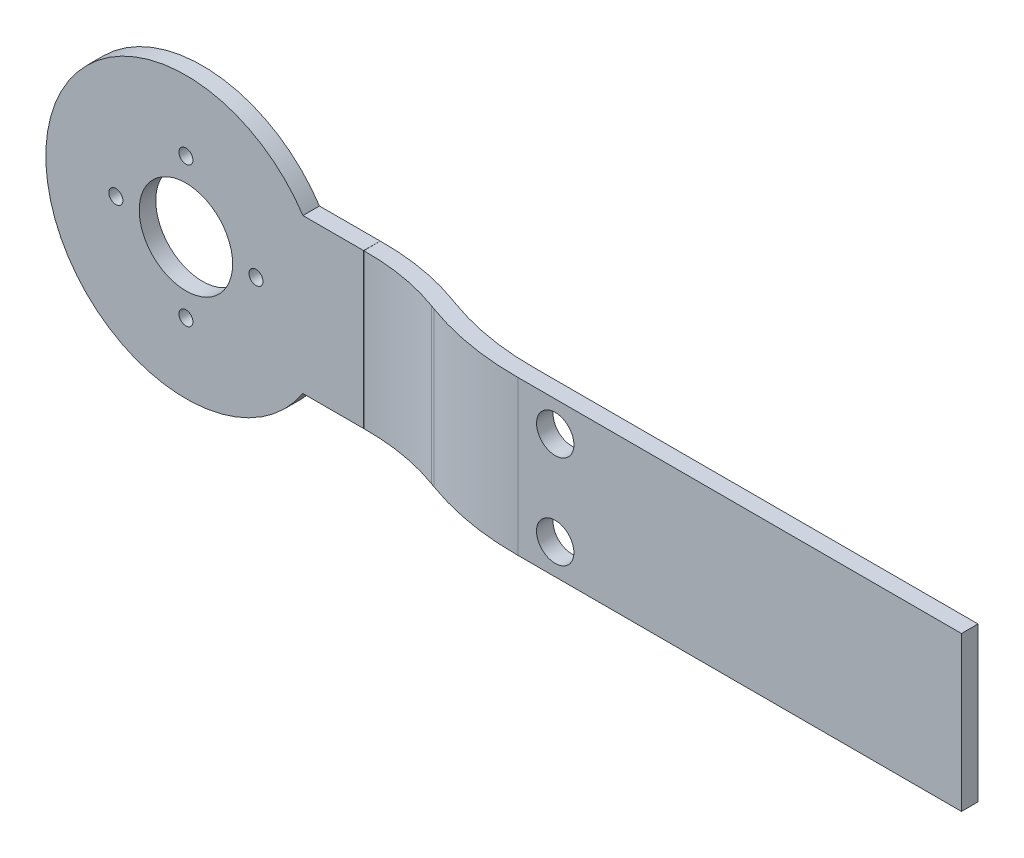
ISO-10303-21;
HEADER;
FILE_DESCRIPTION(('STEP AP214'),'2;1');
FILE_NAME('part.step','',(''),(''),'','','');
FILE_SCHEMA(('AUTOMOTIVE_DESIGN { 1 0 10303 214 1 1 1 1 }'));
ENDSEC;
DATA;
#1=APPLICATION_CONTEXT('core data for automotive mechanical design processes');
#2=APPLICATION_PROTOCOL_DEFINITION('international standard','automotive_design',2000,#1);
#3=PRODUCT_CONTEXT('',#1,'mechanical');
#4=PRODUCT('Part','Part','',(#3));
#5=PRODUCT_RELATED_PRODUCT_CATEGORY('part','',(#4));
#6=PRODUCT_DEFINITION_FORMATION('','',#4);
#7=PRODUCT_DEFINITION_CONTEXT('part definition',#1,'design');
#8=PRODUCT_DEFINITION('design','',#6,#7);
#9=PRODUCT_DEFINITION_SHAPE('','',#8);
#10=(LENGTH_UNIT() NAMED_UNIT(*) SI_UNIT(.MILLI.,.METRE.));
#11=(NAMED_UNIT(*) PLANE_ANGLE_UNIT() SI_UNIT($,.RADIAN.));
#12=(NAMED_UNIT(*) SI_UNIT($,.STERADIAN.) SOLID_ANGLE_UNIT());
#13=UNCERTAINTY_MEASURE_WITH_UNIT(LENGTH_MEASURE(1.E-05),#10,'distance_accuracy_value','');
#14=(GEOMETRIC_REPRESENTATION_CONTEXT(3) GLOBAL_UNCERTAINTY_ASSIGNED_CONTEXT((#13)) GLOBAL_UNIT_ASSIGNED_CONTEXT((#10,
#11,#12)) REPRESENTATION_CONTEXT('',''));
#15=CARTESIAN_POINT('',(0.,0.,0.));
#16=DIRECTION('',(0.,0.,1.));
#17=DIRECTION('',(1.,0.,0.));
#18=AXIS2_PLACEMENT_3D('',#15,#16,#17);
#19=CARTESIAN_POINT('',(25.0549396327351,-16.5,0.));
#20=DIRECTION('',(0.,-1.,0.));
#21=DIRECTION('',(0.,0.,-1.));
#22=AXIS2_PLACEMENT_3D('',#19,#20,#21);
#23=PLANE('',#22);
#24=CARTESIAN_POINT('',(77.5194023312404,-16.5,-51.1831946664342));
#25=DIRECTION('',(0.,-1.,0.));
#26=DIRECTION('',(0.,0.,-1.));
#27=AXIS2_PLACEMENT_3D('',#24,#25,#26);
#28=CIRCLE('',#27,58.1856592451566);
#29=CARTESIAN_POINT('',(78.0549396327351,-16.5,7.));
#30=VERTEX_POINT('',#29);
#31=CARTESIAN_POINT('',(57.6187348167134,-16.5,3.49343996180273));
#32=VERTEX_POINT('',#31);
#33=EDGE_CURVE('E58',#30,#32,#28,.T.);
#34=ORIENTED_EDGE('',*,*,#33,.F.);
#35=DIRECTION('',(-1.,0.,0.));
#36=VECTOR('',#35,1.);
#37=CARTESIAN_POINT('',(78.0549396327351,-16.5,7.));
#38=LINE('',#37,#36);
#39=CARTESIAN_POINT('',(173.054939632735,-16.5,7.));
#40=VERTEX_POINT('',#39);
#41=EDGE_CURVE('E158',#40,#30,#38,.T.);
#42=ORIENTED_EDGE('',*,*,#41,.F.);
#43=DIRECTION('',(0.,0.,-1.));
#44=VECTOR('',#43,1.);
#45=CARTESIAN_POINT('',(173.054939632735,-16.5,7.));
#46=LINE('',#45,#44);
#47=CARTESIAN_POINT('',(173.054939632735,-16.5,10.54));
#48=VERTEX_POINT('',#47);
#49=EDGE_CURVE('E162',#48,#40,#46,.T.);
#50=ORIENTED_EDGE('',*,*,#49,.F.);
#51=DIRECTION('',(1.,0.,0.));
#52=VECTOR('',#51,1.);
#53=CARTESIAN_POINT('',(78.0709904190798,-16.5,10.54));
#54=LINE('',#53,#52);
#55=CARTESIAN_POINT('',(78.0709904190798,-16.5,10.54));
#56=VERTEX_POINT('',#55);
#57=EDGE_CURVE('E166',#56,#48,#54,.T.);
#58=ORIENTED_EDGE('',*,*,#57,.F.);
#59=CARTESIAN_POINT('',(77.5194023312404,-16.5,-51.1831946664342));
#60=DIRECTION('',(0.,-1.,0.));
#61=DIRECTION('',(0.,0.,-1.));
#62=AXIS2_PLACEMENT_3D('',#59,#60,#61);
#63=CIRCLE('',#62,61.7256592451566);
#64=CARTESIAN_POINT('',(56.4079835093406,-16.5,6.81995183938485));
#65=VERTEX_POINT('',#64);
#66=EDGE_CURVE('E170',#65,#56,#63,.F.);
#67=ORIENTED_EDGE('',*,*,#66,.F.);
#68=DIRECTION('',(0.939692620785911,0.,0.342020143325663));
#69=VECTOR('',#68,1.);
#70=CARTESIAN_POINT('',(55.4969783145664,-16.5,6.48837306522519));
#71=LINE('',#70,#69);
#72=CARTESIAN_POINT('',(55.4969783145664,-16.5,6.48837306522519));
#73=VERTEX_POINT('',#72);
#74=EDGE_CURVE('E174',#73,#65,#71,.T.);
#75=ORIENTED_EDGE('',*,*,#74,.F.);
#76=CARTESIAN_POINT('',(38.7498432549536,-16.5,52.5007484820678));
#77=DIRECTION('',(0.,-1.,0.));
#78=DIRECTION('',(0.,0.,-1.));
#79=AXIS2_PLACEMENT_3D('',#76,#77,#78);
#80=CIRCLE('',#79,48.9653471774211);
#81=CARTESIAN_POINT('',(38.1017912193809,-16.5,3.539689948121));
#82=VERTEX_POINT('',#81);
#83=EDGE_CURVE('E178',#82,#73,#80,.T.);
#84=ORIENTED_EDGE('',*,*,#83,.F.);
#85=DIRECTION('',(0.0132349114818786,0.,0.999912414723443));
#86=VECTOR('',#85,1.);
#87=CARTESIAN_POINT('',(38.0549396327351,-16.5,0.));
#88=LINE('',#87,#86);
#89=CARTESIAN_POINT('',(38.0549396327351,-16.5,0.));
#90=VERTEX_POINT('',#89);
#91=EDGE_CURVE('E100',#90,#82,#88,.T.);
#92=ORIENTED_EDGE('',*,*,#91,.F.);
#93=CARTESIAN_POINT('',(38.7498432549536,-16.5,52.5007484820678));
#94=DIRECTION('',(0.,-1.,0.));
#95=DIRECTION('',(0.,0.,-1.));
#96=AXIS2_PLACEMENT_3D('',#93,#94,#95);
#97=CIRCLE('',#96,52.5053471774211);
#98=CARTESIAN_POINT('',(56.7077296219393,-16.5000000000001,3.16186118764308));
#99=VERTEX_POINT('',#98);
#100=EDGE_CURVE('E105',#99,#90,#97,.F.);
#101=ORIENTED_EDGE('',*,*,#100,.F.);
#102=DIRECTION('',(-0.93969262078591,0.,-0.342020143325665));
#103=VECTOR('',#102,1.);
#104=CARTESIAN_POINT('',(56.7077296219393,-16.5,3.16186118764308));
#105=LINE('',#104,#103);
#106=EDGE_CURVE('E138',#32,#99,#105,.T.);
#107=ORIENTED_EDGE('',*,*,#106,.F.);
#108=EDGE_LOOP('',(#34,#42,#50,#58,#67,#75,#84,#92,#101,#107));
#109=FACE_BOUND('',#108,.T.);
#110=ADVANCED_FACE('F49',(#109),#23,.T.);
#111=CARTESIAN_POINT('',(77.5194023312404,16.5,-51.1831946664342));
#112=DIRECTION('',(0.,-1.,0.));
#113=DIRECTION('',(0.,0.,-1.));
#114=AXIS2_PLACEMENT_3D('',#111,#112,#113);
#115=PLANE('',#114);
#116=CARTESIAN_POINT('',(77.5194023312404,16.5,-51.1831946664342));
#117=DIRECTION('',(0.,-1.,0.));
#118=DIRECTION('',(0.,0.,-1.));
#119=AXIS2_PLACEMENT_3D('',#116,#117,#118);
#120=CIRCLE('',#119,58.1856592451566);
#121=CARTESIAN_POINT('',(78.0549396327351,16.5,7.));
#122=VERTEX_POINT('',#121);
#123=CARTESIAN_POINT('',(57.6187348167134,16.5,3.49343996180273));
#124=VERTEX_POINT('',#123);
#125=EDGE_CURVE('E149',#122,#124,#120,.T.);
#126=ORIENTED_EDGE('',*,*,#125,.T.);
#127=DIRECTION('',(-0.93969262078591,0.,-0.342020143325665));
#128=VECTOR('',#127,1.);
#129=CARTESIAN_POINT('',(56.7077296219393,16.5,3.16186118764308));
#130=LINE('',#129,#128);
#131=CARTESIAN_POINT('',(56.7077296219393,16.5,3.16186118764308));
#132=VERTEX_POINT('',#131);
#133=EDGE_CURVE('E136',#124,#132,#130,.T.);
#134=ORIENTED_EDGE('',*,*,#133,.T.);
#135=CARTESIAN_POINT('',(38.7498432549536,16.5,52.5007484820678));
#136=DIRECTION('',(0.,1.,0.));
#137=DIRECTION('',(0.,0.,-1.));
#138=AXIS2_PLACEMENT_3D('',#135,#136,#137);
#139=CIRCLE('',#138,52.5053471774211);
#140=CARTESIAN_POINT('',(38.0549396327351,16.5,0.));
#141=VERTEX_POINT('',#140);
#142=EDGE_CURVE('E141',#132,#141,#139,.T.);
#143=ORIENTED_EDGE('',*,*,#142,.T.);
#144=DIRECTION('',(0.0132349114818786,0.,0.999912414723443));
#145=VECTOR('',#144,1.);
#146=CARTESIAN_POINT('',(38.0549396327351,16.5,0.));
#147=LINE('',#146,#145);
#148=CARTESIAN_POINT('',(38.101791219381,16.5,3.539689948121));
#149=VERTEX_POINT('',#148);
#150=EDGE_CURVE('E145',#141,#149,#147,.T.);
#151=ORIENTED_EDGE('',*,*,#150,.T.);
#152=CARTESIAN_POINT('',(38.7498432549536,16.5,52.5007484820678));
#153=DIRECTION('',(0.,-1.,0.));
#154=DIRECTION('',(0.,0.,-1.));
#155=AXIS2_PLACEMENT_3D('',#152,#153,#154);
#156=CIRCLE('',#155,48.9653471774211);
#157=CARTESIAN_POINT('',(55.4969783145664,16.5,6.48837306522519));
#158=VERTEX_POINT('',#157);
#159=EDGE_CURVE('E218',#149,#158,#156,.T.);
#160=ORIENTED_EDGE('',*,*,#159,.T.);
#161=DIRECTION('',(0.939692620785911,0.,0.342020143325663));
#162=VECTOR('',#161,1.);
#163=CARTESIAN_POINT('',(55.4969783145664,16.5,6.48837306522519));
#164=LINE('',#163,#162);
#165=CARTESIAN_POINT('',(56.4079835093406,16.5,6.81995183938485));
#166=VERTEX_POINT('',#165);
#167=EDGE_CURVE('E215',#158,#166,#164,.T.);
#168=ORIENTED_EDGE('',*,*,#167,.T.);
#169=CARTESIAN_POINT('',(77.5194023312404,16.5,-51.1831946664342));
#170=DIRECTION('',(0.,1.,0.));
#171=DIRECTION('',(0.,0.,-1.));
#172=AXIS2_PLACEMENT_3D('',#169,#170,#171);
#173=CIRCLE('',#172,61.7256592451566);
#174=CARTESIAN_POINT('',(78.0709904190798,16.5,10.54));
#175=VERTEX_POINT('',#174);
#176=EDGE_CURVE('E212',#166,#175,#173,.T.);
#177=ORIENTED_EDGE('',*,*,#176,.T.);
#178=DIRECTION('',(1.,0.,0.));
#179=VECTOR('',#178,1.);
#180=CARTESIAN_POINT('',(78.0709904190798,16.5,10.54));
#181=LINE('',#180,#179);
#182=CARTESIAN_POINT('',(173.054939632735,16.5,10.54));
#183=VERTEX_POINT('',#182);
#184=EDGE_CURVE('E209',#175,#183,#181,.T.);
#185=ORIENTED_EDGE('',*,*,#184,.T.);
#186=DIRECTION('',(0.,0.,-1.));
#187=VECTOR('',#186,1.);
#188=CARTESIAN_POINT('',(173.054939632735,16.5,7.));
#189=LINE('',#188,#187);
#190=CARTESIAN_POINT('',(173.054939632735,16.5,7.));
#191=VERTEX_POINT('',#190);
#192=EDGE_CURVE('E206',#183,#191,#189,.T.);
#193=ORIENTED_EDGE('',*,*,#192,.T.);
#194=DIRECTION('',(-1.,0.,0.));
#195=VECTOR('',#194,1.);
#196=CARTESIAN_POINT('',(78.0549396327351,16.5,7.));
#197=LINE('',#196,#195);
#198=EDGE_CURVE('E155',#191,#122,#197,.T.);
#199=ORIENTED_EDGE('',*,*,#198,.T.);
#200=EDGE_LOOP('',(#126,#134,#143,#151,#160,#168,#177,#185,#193,#199));
#201=FACE_BOUND('',#200,.T.);
#202=ADVANCED_FACE('F147',(#201),#115,.F.);
#203=CARTESIAN_POINT('',(56.7077296219393,-151.911375237486,3.16186118764308));
#204=DIRECTION('',(0.342020143325665,0.,-0.93969262078591));
#205=DIRECTION('',(-0.93969262078591,0.,-0.342020143325665));
#206=AXIS2_PLACEMENT_3D('',#203,#204,#205);
#207=PLANE('',#206);
#208=DIRECTION('',(0.,1.,0.));
#209=VECTOR('',#208,1.);
#210=CARTESIAN_POINT('',(57.6187348167134,-151.911375237486,3.49343996180273));
#211=LINE('',#210,#209);
#212=EDGE_CURVE('E12',#32,#124,#211,.T.);
#213=ORIENTED_EDGE('',*,*,#212,.F.);
#214=ORIENTED_EDGE('',*,*,#106,.T.);
#215=DIRECTION('',(0.,1.,0.));
#216=VECTOR('',#215,1.);
#217=CARTESIAN_POINT('',(56.7077296219393,-151.911375237486,3.16186118764308));
#218=LINE('',#217,#216);
#219=EDGE_CURVE('E133',#99,#132,#218,.T.);
#220=ORIENTED_EDGE('',*,*,#219,.T.);
#221=ORIENTED_EDGE('',*,*,#133,.F.);
#222=EDGE_LOOP('',(#213,#214,#220,#221));
#223=FACE_BOUND('',#222,.T.);
#224=ADVANCED_FACE('F134',(#223),#207,.T.);
#225=CARTESIAN_POINT('',(38.7498432549536,-151.911375237486,52.5007484820678));
#226=DIRECTION('',(0.,1.,0.));
#227=DIRECTION('',(0.,0.,1.));
#228=AXIS2_PLACEMENT_3D('',#225,#226,#227);
#229=CYLINDRICAL_SURFACE('',#228,52.5053471774211);
#230=ORIENTED_EDGE('',*,*,#219,.F.);
#231=ORIENTED_EDGE('',*,*,#100,.T.);
#232=DIRECTION('',(0.,1.,0.));
#233=VECTOR('',#232,1.);
#234=CARTESIAN_POINT('',(38.0549396327351,-151.911375237486,0.));
#235=LINE('',#234,#233);
#236=EDGE_CURVE('E128',#90,#141,#235,.T.);
#237=ORIENTED_EDGE('',*,*,#236,.T.);
#238=ORIENTED_EDGE('',*,*,#142,.F.);
#239=EDGE_LOOP('',(#230,#231,#237,#238));
#240=FACE_BOUND('',#239,.T.);
#241=ADVANCED_FACE('F142',(#240),#229,.T.);
#242=CARTESIAN_POINT('',(38.0549396327351,-151.911375237486,0.));
#243=DIRECTION('',(-0.999912414723443,0.,0.0132349114818786));
#244=DIRECTION('',(0.0132349114818786,0.,0.999912414723443));
#245=AXIS2_PLACEMENT_3D('',#242,#243,#244);
#246=PLANE('',#245);
#247=ORIENTED_EDGE('',*,*,#236,.F.);
#248=ORIENTED_EDGE('',*,*,#91,.T.);
#249=DIRECTION('',(0.,1.,0.));
#250=VECTOR('',#249,1.);
#251=CARTESIAN_POINT('',(38.101791219381,-151.911375237486,3.539689948121));
#252=LINE('',#251,#250);
#253=EDGE_CURVE('E181',#82,#149,#252,.T.);
#254=ORIENTED_EDGE('',*,*,#253,.T.);
#255=ORIENTED_EDGE('',*,*,#150,.F.);
#256=EDGE_LOOP('',(#247,#248,#254,#255));
#257=FACE_BOUND('',#256,.T.);
#258=ADVANCED_FACE('F222',(#257),#246,.T.);
#259=CARTESIAN_POINT('',(38.7498432549536,-151.911375237486,52.5007484820678));
#260=DIRECTION('',(0.,1.,0.));
#261=DIRECTION('',(0.,0.,1.));
#262=AXIS2_PLACEMENT_3D('',#259,#260,#261);
#263=CYLINDRICAL_SURFACE('',#262,48.9653471774211);
#264=ORIENTED_EDGE('',*,*,#253,.F.);
#265=ORIENTED_EDGE('',*,*,#83,.T.);
#266=DIRECTION('',(0.,1.,0.));
#267=VECTOR('',#266,1.);
#268=CARTESIAN_POINT('',(55.4969783145664,-151.911375237486,6.48837306522519));
#269=LINE('',#268,#267);
#270=EDGE_CURVE('E177',#73,#158,#269,.T.);
#271=ORIENTED_EDGE('',*,*,#270,.T.);
#272=ORIENTED_EDGE('',*,*,#159,.F.);
#273=EDGE_LOOP('',(#264,#265,#271,#272));
#274=FACE_BOUND('',#273,.T.);
#275=ADVANCED_FACE('F225',(#274),#263,.F.);
#276=CARTESIAN_POINT('',(55.4969783145664,-151.911375237486,6.48837306522519));
#277=DIRECTION('',(-0.342020143325663,0.,0.939692620785911));
#278=DIRECTION('',(0.939692620785911,0.,0.342020143325663));
#279=AXIS2_PLACEMENT_3D('',#276,#277,#278);
#280=PLANE('',#279);
#281=ORIENTED_EDGE('',*,*,#270,.F.);
#282=ORIENTED_EDGE('',*,*,#74,.T.);
#283=DIRECTION('',(0.,1.,0.));
#284=VECTOR('',#283,1.);
#285=CARTESIAN_POINT('',(56.4079835093406,-151.911375237486,6.81995183938485));
#286=LINE('',#285,#284);
#287=EDGE_CURVE('E173',#65,#166,#286,.T.);
#288=ORIENTED_EDGE('',*,*,#287,.T.);
#289=ORIENTED_EDGE('',*,*,#167,.F.);
#290=EDGE_LOOP('',(#281,#282,#288,#289));
#291=FACE_BOUND('',#290,.T.);
#292=ADVANCED_FACE('F229',(#291),#280,.T.);
#293=CARTESIAN_POINT('',(77.5194023312404,-151.911375237486,-51.1831946664342));
#294=DIRECTION('',(0.,1.,0.));
#295=DIRECTION('',(0.,0.,1.));
#296=AXIS2_PLACEMENT_3D('',#293,#294,#295);
#297=CYLINDRICAL_SURFACE('',#296,61.7256592451566);
#298=ORIENTED_EDGE('',*,*,#287,.F.);
#299=ORIENTED_EDGE('',*,*,#66,.T.);
#300=DIRECTION('',(0.,1.,0.));
#301=VECTOR('',#300,1.);
#302=CARTESIAN_POINT('',(78.0709904190798,-151.911375237486,10.54));
#303=LINE('',#302,#301);
#304=EDGE_CURVE('E169',#56,#175,#303,.T.);
#305=ORIENTED_EDGE('',*,*,#304,.T.);
#306=ORIENTED_EDGE('',*,*,#176,.F.);
#307=EDGE_LOOP('',(#298,#299,#305,#306));
#308=FACE_BOUND('',#307,.T.);
#309=ADVANCED_FACE('F234',(#308),#297,.T.);
#310=CARTESIAN_POINT('',(78.0709904190798,-151.911375237486,10.54));
#311=DIRECTION('',(0.,0.,1.));
#312=DIRECTION('',(1.,0.,0.));
#313=AXIS2_PLACEMENT_3D('',#310,#311,#312);
#314=PLANE('',#313);
#315=CARTESIAN_POINT('',(86.0709904190798,10.,10.54));
#316=DIRECTION('',(0.,0.,1.));
#317=DIRECTION('',(1.,0.,0.));
#318=AXIS2_PLACEMENT_3D('',#315,#316,#317);
#319=CIRCLE('',#318,4.00000000000001);
#320=CARTESIAN_POINT('',(90.0709904190798,10.,10.54));
#321=VERTEX_POINT('',#320);
#322=EDGE_CURVE('E193',#321,#321,#319,.T.);
#323=ORIENTED_EDGE('',*,*,#322,.F.);
#324=EDGE_LOOP('',(#323));
#325=FACE_BOUND('',#324,.T.);
#326=CARTESIAN_POINT('',(86.0709904190798,-10.,10.54));
#327=DIRECTION('',(0.,0.,1.));
#328=DIRECTION('',(-1.,0.,0.));
#329=AXIS2_PLACEMENT_3D('',#326,#327,#328);
#330=CIRCLE('',#329,4.00000000000001);
#331=CARTESIAN_POINT('',(82.0709904190797,-10.,10.54));
#332=VERTEX_POINT('',#331);
#333=EDGE_CURVE('E198',#332,#332,#330,.T.);
#334=ORIENTED_EDGE('',*,*,#333,.F.);
#335=EDGE_LOOP('',(#334));
#336=FACE_BOUND('',#335,.T.);
#337=ORIENTED_EDGE('',*,*,#304,.F.);
#338=ORIENTED_EDGE('',*,*,#57,.T.);
#339=DIRECTION('',(0.,1.,0.));
#340=VECTOR('',#339,1.);
#341=CARTESIAN_POINT('',(173.054939632735,-151.911375237486,10.54));
#342=LINE('',#341,#340);
#343=EDGE_CURVE('E165',#48,#183,#342,.T.);
#344=ORIENTED_EDGE('',*,*,#343,.T.);
#345=ORIENTED_EDGE('',*,*,#184,.F.);
#346=EDGE_LOOP('',(#337,#338,#344,#345));
#347=FACE_BOUND('',#346,.T.);
#348=ADVANCED_FACE('F237',(#325,#336,#347),#314,.T.);
#349=CARTESIAN_POINT('',(173.054939632735,-151.911375237486,7.));
#350=DIRECTION('',(1.,0.,0.));
#351=DIRECTION('',(0.,0.,-1.));
#352=AXIS2_PLACEMENT_3D('',#349,#350,#351);
#353=PLANE('',#352);
#354=ORIENTED_EDGE('',*,*,#343,.F.);
#355=ORIENTED_EDGE('',*,*,#49,.T.);
#356=DIRECTION('',(0.,1.,0.));
#357=VECTOR('',#356,1.);
#358=CARTESIAN_POINT('',(173.054939632735,-151.911375237486,7.));
#359=LINE('',#358,#357);
#360=EDGE_CURVE('E161',#40,#191,#359,.T.);
#361=ORIENTED_EDGE('',*,*,#360,.T.);
#362=ORIENTED_EDGE('',*,*,#192,.F.);
#363=EDGE_LOOP('',(#354,#355,#361,#362));
#364=FACE_BOUND('',#363,.T.);
#365=ADVANCED_FACE('F241',(#364),#353,.T.);
#366=CARTESIAN_POINT('',(78.0549396327351,-151.911375237486,7.));
#367=DIRECTION('',(0.,0.,-1.));
#368=DIRECTION('',(-1.,0.,0.));
#369=AXIS2_PLACEMENT_3D('',#366,#367,#368);
#370=PLANE('',#369);
#371=CARTESIAN_POINT('',(86.0709904190798,10.,7.));
#372=DIRECTION('',(0.,0.,-1.));
#373=DIRECTION('',(-1.,0.,0.));
#374=AXIS2_PLACEMENT_3D('',#371,#372,#373);
#375=CIRCLE('',#374,4.00000000000001);
#376=CARTESIAN_POINT('',(82.0709904190797,10.,7.));
#377=VERTEX_POINT('',#376);
#378=EDGE_CURVE('E52',#377,#377,#375,.T.);
#379=ORIENTED_EDGE('',*,*,#378,.F.);
#380=EDGE_LOOP('',(#379));
#381=FACE_BOUND('',#380,.T.);
#382=CARTESIAN_POINT('',(86.0709904190798,-10.,7.));
#383=DIRECTION('',(0.,0.,-1.));
#384=DIRECTION('',(-1.,0.,0.));
#385=AXIS2_PLACEMENT_3D('',#382,#383,#384);
#386=CIRCLE('',#385,4.00000000000001);
#387=CARTESIAN_POINT('',(82.0709904190797,-10.,7.));
#388=VERTEX_POINT('',#387);
#389=EDGE_CURVE('E191',#388,#388,#386,.T.);
#390=ORIENTED_EDGE('',*,*,#389,.F.);
#391=EDGE_LOOP('',(#390));
#392=FACE_BOUND('',#391,.T.);
#393=ORIENTED_EDGE('',*,*,#360,.F.);
#394=ORIENTED_EDGE('',*,*,#41,.T.);
#395=DIRECTION('',(0.,1.,0.));
#396=VECTOR('',#395,1.);
#397=CARTESIAN_POINT('',(78.0549396327351,-151.911375237486,7.));
#398=LINE('',#397,#396);
#399=EDGE_CURVE('E157',#30,#122,#398,.T.);
#400=ORIENTED_EDGE('',*,*,#399,.T.);
#401=ORIENTED_EDGE('',*,*,#198,.F.);
#402=EDGE_LOOP('',(#393,#394,#400,#401));
#403=FACE_BOUND('',#402,.T.);
#404=ADVANCED_FACE('F245',(#381,#392,#403),#370,.T.);
#405=CARTESIAN_POINT('',(77.5194023312404,-151.911375237486,-51.1831946664342));
#406=DIRECTION('',(0.,1.,0.));
#407=DIRECTION('',(0.,0.,1.));
#408=AXIS2_PLACEMENT_3D('',#405,#406,#407);
#409=CYLINDRICAL_SURFACE('',#408,58.1856592451566);
#410=ORIENTED_EDGE('',*,*,#399,.F.);
#411=ORIENTED_EDGE('',*,*,#33,.T.);
#412=ORIENTED_EDGE('',*,*,#212,.T.);
#413=ORIENTED_EDGE('',*,*,#125,.F.);
#414=EDGE_LOOP('',(#410,#411,#412,#413));
#415=FACE_BOUND('',#414,.T.);
#416=ADVANCED_FACE('F247',(#415),#409,.F.);
#417=CARTESIAN_POINT('',(86.0709904190798,-10.,0.540000000000001));
#418=DIRECTION('',(0.,0.,1.));
#419=DIRECTION('',(1.,0.,0.));
#420=AXIS2_PLACEMENT_3D('',#417,#418,#419);
#421=CYLINDRICAL_SURFACE('',#420,4.00000000000001);
#422=ORIENTED_EDGE('',*,*,#389,.T.);
#423=EDGE_LOOP('',(#422));
#424=FACE_BOUND('',#423,.T.);
#425=ORIENTED_EDGE('',*,*,#333,.T.);
#426=EDGE_LOOP('',(#425));
#427=FACE_BOUND('',#426,.T.);
#428=ADVANCED_FACE('F249',(#424,#427),#421,.F.);
#429=CARTESIAN_POINT('',(86.0709904190798,10.,0.540000000000001));
#430=DIRECTION('',(0.,0.,1.));
#431=DIRECTION('',(1.,0.,0.));
#432=AXIS2_PLACEMENT_3D('',#429,#430,#431);
#433=CYLINDRICAL_SURFACE('',#432,4.00000000000001);
#434=ORIENTED_EDGE('',*,*,#378,.T.);
#435=EDGE_LOOP('',(#434));
#436=FACE_BOUND('',#435,.T.);
#437=ORIENTED_EDGE('',*,*,#322,.T.);
#438=EDGE_LOOP('',(#437));
#439=FACE_BOUND('',#438,.T.);
#440=ADVANCED_FACE('F255',(#436,#439),#433,.F.);
#441=CLOSED_SHELL('',(#110,#202,#224,#241,#258,#275,#292,#309,#348,#365,#404,#416,#428,#440));
#442=MANIFOLD_SOLID_BREP('B2',#441);
#443=CARTESIAN_POINT('',(0.,0.,3.54));
#444=DIRECTION('',(0.,0.,-1.));
#445=DIRECTION('',(-1.,0.,0.));
#446=AXIS2_PLACEMENT_3D('',#443,#444,#445);
#447=CYLINDRICAL_SURFACE('',#446,30.);
#448=CARTESIAN_POINT('',(0.,0.,3.54));
#449=DIRECTION('',(0.,0.,1.));
#450=DIRECTION('',(1.,0.,0.));
#451=AXIS2_PLACEMENT_3D('',#448,#449,#450);
#452=CIRCLE('',#451,30.);
#453=CARTESIAN_POINT('',(25.0549396327351,16.5,3.54));
#454=VERTEX_POINT('',#453);
#455=CARTESIAN_POINT('',(25.0549396327351,-16.5,3.54));
#456=VERTEX_POINT('',#455);
#457=EDGE_CURVE('E47',#454,#456,#452,.T.);
#458=ORIENTED_EDGE('',*,*,#457,.F.);
#459=DIRECTION('',(0.,0.,1.));
#460=VECTOR('',#459,1.);
#461=CARTESIAN_POINT('',(25.0549396327351,16.5,0.));
#462=LINE('',#461,#460);
#463=CARTESIAN_POINT('',(25.0549396327351,16.5,0.));
#464=VERTEX_POINT('',#463);
#465=EDGE_CURVE('E441',#464,#454,#462,.T.);
#466=ORIENTED_EDGE('',*,*,#465,.F.);
#467=CARTESIAN_POINT('',(0.,0.,0.));
#468=DIRECTION('',(0.,0.,1.));
#469=DIRECTION('',(1.,0.,0.));
#470=AXIS2_PLACEMENT_3D('',#467,#468,#469);
#471=CIRCLE('',#470,30.);
#472=CARTESIAN_POINT('',(25.0549396327351,-16.5,0.));
#473=VERTEX_POINT('',#472);
#474=EDGE_CURVE('E374',#464,#473,#471,.T.);
#475=ORIENTED_EDGE('',*,*,#474,.T.);
#476=DIRECTION('',(0.,0.,1.));
#477=VECTOR('',#476,1.);
#478=CARTESIAN_POINT('',(25.0549396327351,-16.5,0.));
#479=LINE('',#478,#477);
#480=EDGE_CURVE('E385',#473,#456,#479,.T.);
#481=ORIENTED_EDGE('',*,*,#480,.T.);
#482=EDGE_LOOP('',(#458,#466,#475,#481));
#483=FACE_BOUND('',#482,.T.);
#484=ADVANCED_FACE('F371',(#483),#447,.T.);
#485=CARTESIAN_POINT('',(0.,0.,3.54));
#486=DIRECTION('',(0.,0.,1.));
#487=DIRECTION('',(1.,0.,0.));
#488=AXIS2_PLACEMENT_3D('',#485,#486,#487);
#489=PLANE('',#488);
#490=CARTESIAN_POINT('',(0.,15.,3.54));
#491=DIRECTION('',(0.,0.,1.));
#492=DIRECTION('',(1.,0.,0.));
#493=AXIS2_PLACEMENT_3D('',#490,#491,#492);
#494=CIRCLE('',#493,1.5);
#495=CARTESIAN_POINT('',(1.5,15.,3.54));
#496=VERTEX_POINT('',#495);
#497=EDGE_CURVE('E491',#496,#496,#494,.T.);
#498=ORIENTED_EDGE('',*,*,#497,.F.);
#499=EDGE_LOOP('',(#498));
#500=FACE_BOUND('',#499,.T.);
#501=CARTESIAN_POINT('',(15.0000000000004,3.6721662601683E-13,3.54));
#502=DIRECTION('',(0.,0.,1.));
#503=DIRECTION('',(1.,0.,0.));
#504=AXIS2_PLACEMENT_3D('',#501,#502,#503);
#505=CIRCLE('',#504,1.5);
#506=CARTESIAN_POINT('',(16.5000000000004,3.6721662601683E-13,3.54));
#507=VERTEX_POINT('',#506);
#508=EDGE_CURVE('E501',#507,#507,#505,.T.);
#509=ORIENTED_EDGE('',*,*,#508,.F.);
#510=EDGE_LOOP('',(#509));
#511=FACE_BOUND('',#510,.T.);
#512=CARTESIAN_POINT('',(7.34433252033659E-13,-15.,3.54));
#513=DIRECTION('',(0.,0.,1.));
#514=DIRECTION('',(1.,0.,0.));
#515=AXIS2_PLACEMENT_3D('',#512,#513,#514);
#516=CIRCLE('',#515,1.5);
#517=CARTESIAN_POINT('',(1.50000000000073,-15.,3.54));
#518=VERTEX_POINT('',#517);
#519=EDGE_CURVE('E507',#518,#518,#516,.T.);
#520=ORIENTED_EDGE('',*,*,#519,.F.);
#521=EDGE_LOOP('',(#520));
#522=FACE_BOUND('',#521,.T.);
#523=CARTESIAN_POINT('',(-14.9999999999996,-3.69053596215551E-13,3.54));
#524=DIRECTION('',(0.,0.,1.));
#525=DIRECTION('',(1.,0.,0.));
#526=AXIS2_PLACEMENT_3D('',#523,#524,#525);
#527=CIRCLE('',#526,1.5);
#528=CARTESIAN_POINT('',(-13.4999999999996,-3.69053596215551E-13,3.54));
#529=VERTEX_POINT('',#528);
#530=EDGE_CURVE('E513',#529,#529,#527,.T.);
#531=ORIENTED_EDGE('',*,*,#530,.F.);
#532=EDGE_LOOP('',(#531));
#533=FACE_BOUND('',#532,.T.);
#534=CARTESIAN_POINT('',(0.,0.,3.54));
#535=DIRECTION('',(0.,0.,1.));
#536=DIRECTION('',(1.,0.,0.));
#537=AXIS2_PLACEMENT_3D('',#534,#535,#536);
#538=CIRCLE('',#537,10.);
#539=CARTESIAN_POINT('',(10.,0.,3.54));
#540=VERTEX_POINT('',#539);
#541=EDGE_CURVE('E495',#540,#540,#538,.T.);
#542=ORIENTED_EDGE('',*,*,#541,.F.);
#543=EDGE_LOOP('',(#542));
#544=FACE_BOUND('',#543,.T.);
#545=ORIENTED_EDGE('',*,*,#457,.T.);
#546=DIRECTION('',(1.,0.,0.));
#547=VECTOR('',#546,1.);
#548=CARTESIAN_POINT('',(25.0549396327351,-16.5,3.54));
#549=LINE('',#548,#547);
#550=CARTESIAN_POINT('',(38.0549396327351,-16.5,3.54));
#551=VERTEX_POINT('',#550);
#552=EDGE_CURVE('E438',#456,#551,#549,.T.);
#553=ORIENTED_EDGE('',*,*,#552,.T.);
#554=DIRECTION('',(0.,1.,0.));
#555=VECTOR('',#554,1.);
#556=CARTESIAN_POINT('',(38.0549396327351,16.5,3.54));
#557=LINE('',#556,#555);
#558=CARTESIAN_POINT('',(38.0549396327351,16.5,3.54));
#559=VERTEX_POINT('',#558);
#560=EDGE_CURVE('E414',#551,#559,#557,.T.);
#561=ORIENTED_EDGE('',*,*,#560,.T.);
#562=DIRECTION('',(-1.,0.,0.));
#563=VECTOR('',#562,1.);
#564=CARTESIAN_POINT('',(25.0549396327351,16.5,3.54));
#565=LINE('',#564,#563);
#566=EDGE_CURVE('E429',#559,#454,#565,.T.);
#567=ORIENTED_EDGE('',*,*,#566,.T.);
#568=EDGE_LOOP('',(#545,#553,#561,#567));
#569=FACE_BOUND('',#568,.T.);
#570=ADVANCED_FACE('F447',(#500,#511,#522,#533,#544,#569),#489,.T.);
#571=CARTESIAN_POINT('',(0.,0.,0.));
#572=DIRECTION('',(0.,0.,1.));
#573=DIRECTION('',(1.,0.,0.));
#574=AXIS2_PLACEMENT_3D('',#571,#572,#573);
#575=PLANE('',#574);
#576=CARTESIAN_POINT('',(0.,15.,0.));
#577=DIRECTION('',(0.,0.,1.));
#578=DIRECTION('',(1.,0.,0.));
#579=AXIS2_PLACEMENT_3D('',#576,#577,#578);
#580=CIRCLE('',#579,1.5);
#581=CARTESIAN_POINT('',(1.5,15.,0.));
#582=VERTEX_POINT('',#581);
#583=EDGE_CURVE('E494',#582,#582,#580,.F.);
#584=ORIENTED_EDGE('',*,*,#583,.F.);
#585=EDGE_LOOP('',(#584));
#586=FACE_BOUND('',#585,.T.);
#587=CARTESIAN_POINT('',(15.0000000000004,3.6721662601683E-13,0.));
#588=DIRECTION('',(0.,0.,1.));
#589=DIRECTION('',(1.,0.,0.));
#590=AXIS2_PLACEMENT_3D('',#587,#588,#589);
#591=CIRCLE('',#590,1.5);
#592=CARTESIAN_POINT('',(16.5000000000004,3.6721662601683E-13,0.));
#593=VERTEX_POINT('',#592);
#594=EDGE_CURVE('E498',#593,#593,#591,.F.);
#595=ORIENTED_EDGE('',*,*,#594,.F.);
#596=EDGE_LOOP('',(#595));
#597=FACE_BOUND('',#596,.T.);
#598=CARTESIAN_POINT('',(7.34433252033659E-13,-15.,0.));
#599=DIRECTION('',(0.,0.,1.));
#600=DIRECTION('',(1.,0.,0.));
#601=AXIS2_PLACEMENT_3D('',#598,#599,#600);
#602=CIRCLE('',#601,1.5);
#603=CARTESIAN_POINT('',(1.50000000000073,-15.,0.));
#604=VERTEX_POINT('',#603);
#605=EDGE_CURVE('E504',#604,#604,#602,.F.);
#606=ORIENTED_EDGE('',*,*,#605,.F.);
#607=EDGE_LOOP('',(#606));
#608=FACE_BOUND('',#607,.T.);
#609=CARTESIAN_POINT('',(-14.9999999999996,-3.69053596215551E-13,0.));
#610=DIRECTION('',(0.,0.,1.));
#611=DIRECTION('',(1.,0.,0.));
#612=AXIS2_PLACEMENT_3D('',#609,#610,#611);
#613=CIRCLE('',#612,1.5);
#614=CARTESIAN_POINT('',(-13.4999999999996,-3.69053596215551E-13,0.));
#615=VERTEX_POINT('',#614);
#616=EDGE_CURVE('E510',#615,#615,#613,.F.);
#617=ORIENTED_EDGE('',*,*,#616,.F.);
#618=EDGE_LOOP('',(#617));
#619=FACE_BOUND('',#618,.T.);
#620=CARTESIAN_POINT('',(0.,0.,0.));
#621=DIRECTION('',(0.,0.,1.));
#622=DIRECTION('',(1.,0.,0.));
#623=AXIS2_PLACEMENT_3D('',#620,#621,#622);
#624=CIRCLE('',#623,10.);
#625=CARTESIAN_POINT('',(10.,0.,0.));
#626=VERTEX_POINT('',#625);
#627=EDGE_CURVE('E434',#626,#626,#624,.F.);
#628=ORIENTED_EDGE('',*,*,#627,.F.);
#629=EDGE_LOOP('',(#628));
#630=FACE_BOUND('',#629,.T.);
#631=ORIENTED_EDGE('',*,*,#474,.F.);
#632=DIRECTION('',(-1.,0.,0.));
#633=VECTOR('',#632,1.);
#634=CARTESIAN_POINT('',(25.0549396327351,16.5,0.));
#635=LINE('',#634,#633);
#636=CARTESIAN_POINT('',(38.0549396327351,16.5,0.));
#637=VERTEX_POINT('',#636);
#638=EDGE_CURVE('E426',#637,#464,#635,.T.);
#639=ORIENTED_EDGE('',*,*,#638,.F.);
#640=DIRECTION('',(0.,1.,0.));
#641=VECTOR('',#640,1.);
#642=CARTESIAN_POINT('',(38.0549396327351,16.5,0.));
#643=LINE('',#642,#641);
#644=CARTESIAN_POINT('',(38.0549396327351,-16.5,0.));
#645=VERTEX_POINT('',#644);
#646=EDGE_CURVE('E411',#645,#637,#643,.T.);
#647=ORIENTED_EDGE('',*,*,#646,.F.);
#648=DIRECTION('',(1.,0.,0.));
#649=VECTOR('',#648,1.);
#650=CARTESIAN_POINT('',(25.0549396327351,-16.5,0.));
#651=LINE('',#650,#649);
#652=EDGE_CURVE('E424',#473,#645,#651,.T.);
#653=ORIENTED_EDGE('',*,*,#652,.F.);
#654=EDGE_LOOP('',(#631,#639,#647,#653));
#655=FACE_BOUND('',#654,.T.);
#656=ADVANCED_FACE('F423',(#586,#597,#608,#619,#630,#655),#575,.F.);
#657=CARTESIAN_POINT('',(25.0549396327351,16.5,0.));
#658=DIRECTION('',(0.,1.,0.));
#659=DIRECTION('',(0.,0.,1.));
#660=AXIS2_PLACEMENT_3D('',#657,#658,#659);
#661=PLANE('',#660);
#662=ORIENTED_EDGE('',*,*,#566,.F.);
#663=DIRECTION('',(0.,0.,1.));
#664=VECTOR('',#663,1.);
#665=CARTESIAN_POINT('',(38.0549396327351,16.5,0.));
#666=LINE('',#665,#664);
#667=EDGE_CURVE('E419',#637,#559,#666,.T.);
#668=ORIENTED_EDGE('',*,*,#667,.F.);
#669=ORIENTED_EDGE('',*,*,#638,.T.);
#670=ORIENTED_EDGE('',*,*,#465,.T.);
#671=EDGE_LOOP('',(#662,#668,#669,#670));
#672=FACE_BOUND('',#671,.T.);
#673=ADVANCED_FACE('F448',(#672),#661,.T.);
#674=CARTESIAN_POINT('',(38.0549396327351,16.5,0.));
#675=DIRECTION('',(1.,0.,0.));
#676=DIRECTION('',(0.,0.,-1.));
#677=AXIS2_PLACEMENT_3D('',#674,#675,#676);
#678=PLANE('',#677);
#679=ORIENTED_EDGE('',*,*,#560,.F.);
#680=DIRECTION('',(0.,0.,1.));
#681=VECTOR('',#680,1.);
#682=CARTESIAN_POINT('',(38.0549396327351,-16.5,0.));
#683=LINE('',#682,#681);
#684=EDGE_CURVE('E408',#645,#551,#683,.T.);
#685=ORIENTED_EDGE('',*,*,#684,.F.);
#686=ORIENTED_EDGE('',*,*,#646,.T.);
#687=ORIENTED_EDGE('',*,*,#667,.T.);
#688=EDGE_LOOP('',(#679,#685,#686,#687));
#689=FACE_BOUND('',#688,.T.);
#690=ADVANCED_FACE('F410',(#689),#678,.T.);
#691=CARTESIAN_POINT('',(25.0549396327351,-16.5,0.));
#692=DIRECTION('',(0.,-1.,0.));
#693=DIRECTION('',(0.,0.,-1.));
#694=AXIS2_PLACEMENT_3D('',#691,#692,#693);
#695=PLANE('',#694);
#696=ORIENTED_EDGE('',*,*,#552,.F.);
#697=ORIENTED_EDGE('',*,*,#480,.F.);
#698=ORIENTED_EDGE('',*,*,#652,.T.);
#699=ORIENTED_EDGE('',*,*,#684,.T.);
#700=EDGE_LOOP('',(#696,#697,#698,#699));
#701=FACE_BOUND('',#700,.T.);
#702=ADVANCED_FACE('F428',(#701),#695,.T.);
#703=CARTESIAN_POINT('',(0.,0.,-0.00100000000000013));
#704=DIRECTION('',(0.,0.,1.));
#705=DIRECTION('',(1.,0.,0.));
#706=AXIS2_PLACEMENT_3D('',#703,#704,#705);
#707=CYLINDRICAL_SURFACE('',#706,10.);
#708=ORIENTED_EDGE('',*,*,#541,.T.);
#709=EDGE_LOOP('',(#708));
#710=FACE_BOUND('',#709,.T.);
#711=ORIENTED_EDGE('',*,*,#627,.T.);
#712=EDGE_LOOP('',(#711));
#713=FACE_BOUND('',#712,.T.);
#714=ADVANCED_FACE('F464',(#710,#713),#707,.F.);
#715=CARTESIAN_POINT('',(-14.9999999999996,-3.69053596215551E-13,-0.00100000000000013));
#716=DIRECTION('',(0.,0.,1.));
#717=DIRECTION('',(1.,0.,0.));
#718=AXIS2_PLACEMENT_3D('',#715,#716,#717);
#719=CYLINDRICAL_SURFACE('',#718,1.5);
#720=ORIENTED_EDGE('',*,*,#530,.T.);
#721=EDGE_LOOP('',(#720));
#722=FACE_BOUND('',#721,.T.);
#723=ORIENTED_EDGE('',*,*,#616,.T.);
#724=EDGE_LOOP('',(#723));
#725=FACE_BOUND('',#724,.T.);
#726=ADVANCED_FACE('F471',(#722,#725),#719,.F.);
#727=CARTESIAN_POINT('',(7.34433252033659E-13,-15.,-0.00100000000000013));
#728=DIRECTION('',(0.,0.,1.));
#729=DIRECTION('',(1.,0.,0.));
#730=AXIS2_PLACEMENT_3D('',#727,#728,#729);
#731=CYLINDRICAL_SURFACE('',#730,1.5);
#732=ORIENTED_EDGE('',*,*,#519,.T.);
#733=EDGE_LOOP('',(#732));
#734=FACE_BOUND('',#733,.T.);
#735=ORIENTED_EDGE('',*,*,#605,.T.);
#736=EDGE_LOOP('',(#735));
#737=FACE_BOUND('',#736,.T.);
#738=ADVANCED_FACE('F475',(#734,#737),#731,.F.);
#739=CARTESIAN_POINT('',(15.0000000000004,3.6721662601683E-13,-0.00100000000000013));
#740=DIRECTION('',(0.,0.,1.));
#741=DIRECTION('',(1.,0.,0.));
#742=AXIS2_PLACEMENT_3D('',#739,#740,#741);
#743=CYLINDRICAL_SURFACE('',#742,1.5);
#744=ORIENTED_EDGE('',*,*,#508,.T.);
#745=EDGE_LOOP('',(#744));
#746=FACE_BOUND('',#745,.T.);
#747=ORIENTED_EDGE('',*,*,#594,.T.);
#748=EDGE_LOOP('',(#747));
#749=FACE_BOUND('',#748,.T.);
#750=ADVANCED_FACE('F479',(#746,#749),#743,.F.);
#751=CARTESIAN_POINT('',(0.,15.,-0.00100000000000013));
#752=DIRECTION('',(0.,0.,1.));
#753=DIRECTION('',(1.,0.,0.));
#754=AXIS2_PLACEMENT_3D('',#751,#752,#753);
#755=CYLINDRICAL_SURFACE('',#754,1.5);
#756=ORIENTED_EDGE('',*,*,#497,.T.);
#757=EDGE_LOOP('',(#756));
#758=FACE_BOUND('',#757,.T.);
#759=ORIENTED_EDGE('',*,*,#583,.T.);
#760=EDGE_LOOP('',(#759));
#761=FACE_BOUND('',#760,.T.);
#762=ADVANCED_FACE('F483',(#758,#761),#755,.F.);
#763=CLOSED_SHELL('',(#484,#570,#656,#673,#690,#702,#714,#726,#738,#750,#762));
#764=MANIFOLD_SOLID_BREP('B6',#763);
#765=ADVANCED_BREP_SHAPE_REPRESENTATION('',(#18,#442,#764),#14);
#766=SHAPE_DEFINITION_REPRESENTATION(#9,#765);
ENDSEC;
END-ISO-10303-21;
